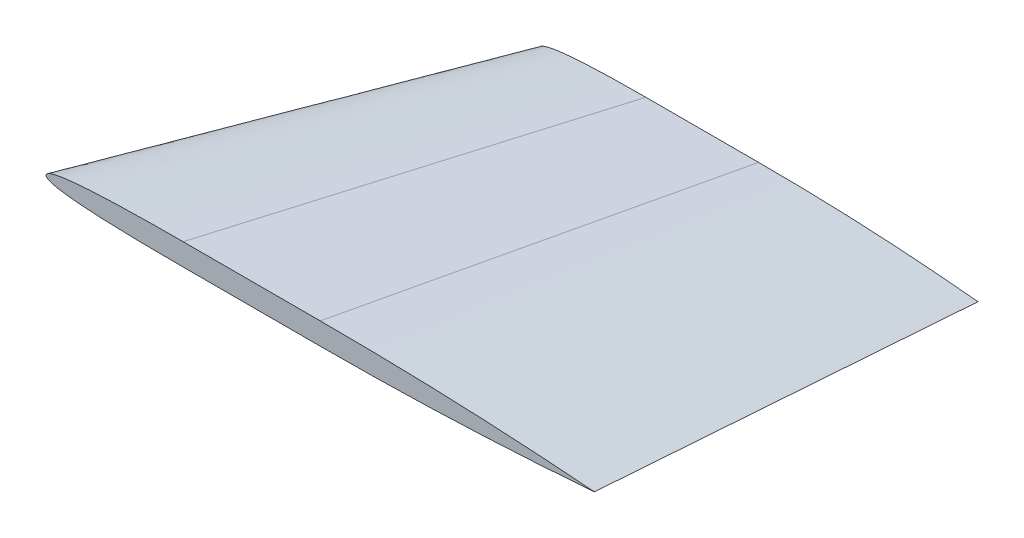
ISO-10303-21;
HEADER;
FILE_DESCRIPTION(('STEP AP214'),'2;1');
FILE_NAME('part.step','',(''),(''),'','','');
FILE_SCHEMA(('AUTOMOTIVE_DESIGN { 1 0 10303 214 1 1 1 1 }'));
ENDSEC;
DATA;
#1=APPLICATION_CONTEXT('core data for automotive mechanical design processes');
#2=APPLICATION_PROTOCOL_DEFINITION('international standard','automotive_design',2000,#1);
#3=PRODUCT_CONTEXT('',#1,'mechanical');
#4=PRODUCT('Part','Part','',(#3));
#5=PRODUCT_RELATED_PRODUCT_CATEGORY('part','',(#4));
#6=PRODUCT_DEFINITION_FORMATION('','',#4);
#7=PRODUCT_DEFINITION_CONTEXT('part definition',#1,'design');
#8=PRODUCT_DEFINITION('design','',#6,#7);
#9=PRODUCT_DEFINITION_SHAPE('','',#8);
#10=(LENGTH_UNIT() NAMED_UNIT(*) SI_UNIT(.MILLI.,.METRE.));
#11=(NAMED_UNIT(*) PLANE_ANGLE_UNIT() SI_UNIT($,.RADIAN.));
#12=(NAMED_UNIT(*) SI_UNIT($,.STERADIAN.) SOLID_ANGLE_UNIT());
#13=UNCERTAINTY_MEASURE_WITH_UNIT(LENGTH_MEASURE(1.E-05),#10,'distance_accuracy_value','');
#14=(GEOMETRIC_REPRESENTATION_CONTEXT(3) GLOBAL_UNCERTAINTY_ASSIGNED_CONTEXT((#13)) GLOBAL_UNIT_ASSIGNED_CONTEXT((#10,
#11,#12)) REPRESENTATION_CONTEXT('',''));
#15=CARTESIAN_POINT('',(0.,0.,0.));
#16=DIRECTION('',(0.,0.,1.));
#17=DIRECTION('',(1.,0.,0.));
#18=AXIS2_PLACEMENT_3D('',#15,#16,#17);
#19=CARTESIAN_POINT('',(-33.3550389878657,4.,-28.8888888888889));
#20=DIRECTION('',(0.,0.,1.));
#21=DIRECTION('',(1.,0.,0.));
#22=AXIS2_PLACEMENT_3D('',#19,#20,#21);
#23=PLANE('',#22);
#24=CARTESIAN_POINT('',(6.64496101213428,4.,-28.8888888888889));
#25=CARTESIAN_POINT('',(26.7077862215503,4.,-28.8888888888889));
#26=CARTESIAN_POINT('',(46.6449610121343,2.,-28.8888888888889));
#27=B_SPLINE_CURVE_WITH_KNOTS('',2,(#24,#25,#26),.UNSPECIFIED.,.F.,.F.,(3,3),(0.,1.),.UNSPECIFIED.);
#28=CARTESIAN_POINT('',(6.64496101213428,4.,-28.8888888888889));
#29=VERTEX_POINT('',#28);
#30=CARTESIAN_POINT('',(46.6449610121343,2.,-28.8888888888889));
#31=VERTEX_POINT('',#30);
#32=EDGE_CURVE('E179',#29,#31,#27,.T.);
#33=ORIENTED_EDGE('',*,*,#32,.T.);
#34=CARTESIAN_POINT('',(6.64496101213428,0.,-28.8888888888889));
#35=CARTESIAN_POINT('',(26.7077862215503,0.,-28.8888888888889));
#36=CARTESIAN_POINT('',(46.6449610121343,2.,-28.8888888888889));
#37=B_SPLINE_CURVE_WITH_KNOTS('',2,(#34,#35,#36),.UNSPECIFIED.,.F.,.F.,(3,3),(0.,1.),.UNSPECIFIED.);
#38=CARTESIAN_POINT('',(6.64496101213428,0.,-28.8888888888889));
#39=VERTEX_POINT('',#38);
#40=EDGE_CURVE('E230',#39,#31,#37,.T.);
#41=ORIENTED_EDGE('',*,*,#40,.F.);
#42=DIRECTION('',(-1.,0.,0.));
#43=VECTOR('',#42,1.);
#44=CARTESIAN_POINT('',(-33.3550389878657,0.,-28.8888888888889));
#45=LINE('',#44,#43);
#46=CARTESIAN_POINT('',(-13.9262542839707,0.,-28.8888888888889));
#47=VERTEX_POINT('',#46);
#48=EDGE_CURVE('E242',#39,#47,#45,.T.);
#49=ORIENTED_EDGE('',*,*,#48,.T.);
#50=CARTESIAN_POINT('',(-33.3550389878657,2.,-28.8888888888889));
#51=CARTESIAN_POINT('',(-33.4760150422879,-0.0145076739486985,-28.8888888888889));
#52=CARTESIAN_POINT('',(-13.3550389878657,0.,-28.8888888888889));
#53=B_SPLINE_CURVE_WITH_KNOTS('',2,(#50,#51,#52),.UNSPECIFIED.,.F.,.F.,(3,3),(0.,1.),.UNSPECIFIED.);
#54=CARTESIAN_POINT('',(-33.3550389878657,1.95213106263249,-28.8888888888889));
#55=VERTEX_POINT('',#54);
#56=EDGE_CURVE('E313',#55,#47,#53,.T.);
#57=ORIENTED_EDGE('',*,*,#56,.F.);
#58=DIRECTION('',(0.,-1.,0.));
#59=VECTOR('',#58,1.);
#60=CARTESIAN_POINT('',(-33.3550389878657,4.,-28.8888888888889));
#61=LINE('',#60,#59);
#62=CARTESIAN_POINT('',(-33.3550389878657,2.04786893736751,-28.8888888888889));
#63=VERTEX_POINT('',#62);
#64=EDGE_CURVE('E13',#63,#55,#61,.T.);
#65=ORIENTED_EDGE('',*,*,#64,.F.);
#66=CARTESIAN_POINT('',(-33.3550389878657,2.,-28.8888888888889));
#67=CARTESIAN_POINT('',(-33.4760150422879,4.0145076739487,-28.8888888888889));
#68=CARTESIAN_POINT('',(-13.3550389878657,4.,-28.8888888888889));
#69=B_SPLINE_CURVE_WITH_KNOTS('',2,(#66,#67,#68),.UNSPECIFIED.,.F.,.F.,(3,3),(0.,1.),.UNSPECIFIED.);
#70=CARTESIAN_POINT('',(-13.9262542699637,4.,-28.8888888888889));
#71=VERTEX_POINT('',#70);
#72=EDGE_CURVE('E394',#63,#71,#69,.T.);
#73=ORIENTED_EDGE('',*,*,#72,.T.);
#74=DIRECTION('',(-1.,0.,0.));
#75=VECTOR('',#74,1.);
#76=CARTESIAN_POINT('',(-33.3550389878657,4.,-28.8888888888889));
#77=LINE('',#76,#75);
#78=EDGE_CURVE('E258',#29,#71,#77,.T.);
#79=ORIENTED_EDGE('',*,*,#78,.F.);
#80=EDGE_LOOP('',(#33,#41,#49,#57,#65,#73,#79));
#81=FACE_BOUND('',#80,.T.);
#82=ADVANCED_FACE('F160',(#81),#23,.F.);
#83=CARTESIAN_POINT('',(-58.3062012651678,4.,36.1111111111111));
#84=DIRECTION('',(0.,0.,-1.));
#85=DIRECTION('',(-1.,0.,0.));
#86=AXIS2_PLACEMENT_3D('',#83,#84,#85);
#87=PLANE('',#86);
#88=CARTESIAN_POINT('',(-8.30620126516783,4.,36.1111111111111));
#89=CARTESIAN_POINT('',(16.7498645575744,3.99999999999985,36.1111111111111));
#90=CARTESIAN_POINT('',(41.6937987348322,2.,36.1111111111111));
#91=B_SPLINE_CURVE_WITH_KNOTS('',2,(#88,#89,#90),.UNSPECIFIED.,.F.,.F.,(3,3),(0.,1.),.UNSPECIFIED.);
#92=CARTESIAN_POINT('',(-8.30620126516783,4.,36.1111111111111));
#93=VERTEX_POINT('',#92);
#94=CARTESIAN_POINT('',(41.6937987348322,2.,36.1111111111111));
#95=VERTEX_POINT('',#94);
#96=EDGE_CURVE('E219',#93,#95,#91,.T.);
#97=ORIENTED_EDGE('',*,*,#96,.F.);
#98=DIRECTION('',(1.,0.,0.));
#99=VECTOR('',#98,1.);
#100=CARTESIAN_POINT('',(-58.3062012651678,4.,36.1111111111111));
#101=LINE('',#100,#99);
#102=CARTESIAN_POINT('',(-33.3062012651678,4.,36.1111111111111));
#103=VERTEX_POINT('',#102);
#104=EDGE_CURVE('E171',#103,#93,#101,.T.);
#105=ORIENTED_EDGE('',*,*,#104,.F.);
#106=CARTESIAN_POINT('',(-58.3062012651678,2.,36.1111111111111));
#107=CARTESIAN_POINT('',(-58.2981682863198,2.13185803387447,36.1111111111111));
#108=CARTESIAN_POINT('',(-58.1165495380855,2.35127824547839,36.111111111111));
#109=CARTESIAN_POINT('',(-57.6523540562812,2.59937777239833,36.1111111111112));
#110=CARTESIAN_POINT('',(-57.0197515682006,2.80617439716223,36.1111111111109));
#111=CARTESIAN_POINT('',(-56.3769150244662,2.95010416964718,36.1111111111112));
#112=CARTESIAN_POINT('',(-55.8568799760318,3.04843051159478,36.111111111111));
#113=CARTESIAN_POINT('',(-55.3359662965871,3.13504754543367,36.1111111111111));
#114=CARTESIAN_POINT('',(-54.6818489795879,3.2286430482675,36.1111111111112));
#115=CARTESIAN_POINT('',(-53.6326085869534,3.35434667278868,36.111111111111));
#116=CARTESIAN_POINT('',(-52.3173026060738,3.47915567883608,36.1111111111112));
#117=CARTESIAN_POINT('',(-50.7363419329291,3.59550791665806,36.1111111111111));
#118=CARTESIAN_POINT('',(-49.1537633268489,3.68800069592946,36.1111111111111));
#119=CARTESIAN_POINT('',(-47.5702823950902,3.76243746410943,36.1111111111112));
#120=CARTESIAN_POINT('',(-45.9861816087334,3.82258876530267,36.111111111111));
#121=CARTESIAN_POINT('',(-44.4016961914234,3.87109571460881,36.1111111111112));
#122=CARTESIAN_POINT('',(-42.8169399486992,3.9098609061408,36.1111111111111));
#123=CARTESIAN_POINT('',(-41.2320059940613,3.94034760640304,36.1111111111111));
#124=CARTESIAN_POINT('',(-39.1186009927977,3.97140917344183,36.1111111111111));
#125=CARTESIAN_POINT('',(-36.4766432024574,3.99460959973484,36.1111111111111));
#126=CARTESIAN_POINT('',(-34.3630212451883,4.,36.1111111111111));
#127=CARTESIAN_POINT('',(-33.3062012651678,4.,36.1111111111111));
#128=B_SPLINE_CURVE_WITH_KNOTS('',3,(#106,#107,#108,#109,#110,#111,#112,#113,#114,#115,#116,
#117,#118,#119,#120,#121,#122,#123,#124,#125,#126,#127),.UNSPECIFIED.,.F.,.F.,(4,1,1,1,1,1,1,1,
1,1,1,1,1,1,1,1,1,1,1,4),(0.474415888325319,0.481959711641861,0.489503534958403,
0.504591181591488,0.519678828224572,0.527222651541114,0.534766474857656,0.549854121490741,
0.564941768123825,0.595117061389994,0.625292354656163,0.655467647922332,0.685642941188501,
0.71581823445467,0.745993527720838,0.776168820987007,0.806344114253176,0.836519407519345,
0.896869994051683,0.95722058058402),.UNSPECIFIED.);
#129=CARTESIAN_POINT('',(-58.3057212466994,2.00600220058824,36.1111111111111));
#130=VERTEX_POINT('',#129);
#131=EDGE_CURVE('E280',#130,#103,#128,.T.);
#132=ORIENTED_EDGE('',*,*,#131,.F.);
#133=CARTESIAN_POINT('',(-58.3062012651678,2.,36.1111111111111));
#134=CARTESIAN_POINT('',(-58.1843584223458,0.,36.1111111111111));
#135=CARTESIAN_POINT('',(-33.3062012651678,0.,36.1111111111111));
#136=B_SPLINE_CURVE_WITH_KNOTS('',2,(#133,#134,#135),.UNSPECIFIED.,.F.,.F.,(3,3),(0.,1.),.UNSPECIFIED.);
#137=CARTESIAN_POINT('',(-33.3062012651678,0.,36.1111111111111));
#138=VERTEX_POINT('',#137);
#139=EDGE_CURVE('E253',#130,#138,#136,.T.);
#140=ORIENTED_EDGE('',*,*,#139,.T.);
#141=DIRECTION('',(1.,0.,0.));
#142=VECTOR('',#141,1.);
#143=CARTESIAN_POINT('',(-58.3062012651678,0.,36.1111111111111));
#144=LINE('',#143,#142);
#145=CARTESIAN_POINT('',(-8.30620126516783,0.,36.1111111111111));
#146=VERTEX_POINT('',#145);
#147=EDGE_CURVE('E237',#138,#146,#144,.T.);
#148=ORIENTED_EDGE('',*,*,#147,.T.);
#149=CARTESIAN_POINT('',(-8.30620126516783,0.,36.1111111111111));
#150=CARTESIAN_POINT('',(16.7498645575744,1.47444782547332E-13,36.1111111111111));
#151=CARTESIAN_POINT('',(41.6937987348322,2.,36.1111111111111));
#152=B_SPLINE_CURVE_WITH_KNOTS('',2,(#149,#150,#151),.UNSPECIFIED.,.F.,.F.,(3,3),(0.,1.),.UNSPECIFIED.);
#153=EDGE_CURVE('E187',#146,#95,#152,.T.);
#154=ORIENTED_EDGE('',*,*,#153,.T.);
#155=EDGE_LOOP('',(#97,#105,#132,#140,#148,#154));
#156=FACE_BOUND('',#155,.T.);
#157=ADVANCED_FACE('F234',(#156),#87,.F.);
#158=CARTESIAN_POINT('',(0.,0.,0.));
#159=DIRECTION('',(0.,-1.,0.));
#160=DIRECTION('',(0.,0.,-1.));
#161=AXIS2_PLACEMENT_3D('',#158,#159,#160);
#162=PLANE('',#161);
#163=ORIENTED_EDGE('',*,*,#48,.F.);
#164=DIRECTION('',(0.224164243499484,0.,-0.974551379833975));
#165=VECTOR('',#164,1.);
#166=CARTESIAN_POINT('',(-8.30620126516783,0.,36.1111111111111));
#167=LINE('',#166,#165);
#168=EDGE_CURVE('E231',#146,#39,#167,.T.);
#169=ORIENTED_EDGE('',*,*,#168,.F.);
#170=ORIENTED_EDGE('',*,*,#147,.F.);
#171=DIRECTION('',(0.285725184112015,-2.4522769170667E-09,-0.958311598158008));
#172=VECTOR('',#171,1.);
#173=CARTESIAN_POINT('',(-23.6161709018816,-8.31660599306728E-08,3.61111111111111));
#174=LINE('',#173,#172);
#175=EDGE_CURVE('E487',#138,#47,#174,.T.);
#176=ORIENTED_EDGE('',*,*,#175,.T.);
#177=EDGE_LOOP('',(#163,#169,#170,#176));
#178=FACE_BOUND('',#177,.T.);
#179=ADVANCED_FACE('F293',(#178),#162,.T.);
#180=CARTESIAN_POINT('',(-58.3062012651678,4.,36.1111111111111));
#181=DIRECTION('',(0.933580426497201,0.,0.358367949545301));
#182=DIRECTION('',(0.358367949545301,0.,-0.933580426497201));
#183=AXIS2_PLACEMENT_3D('',#180,#181,#182);
#184=PLANE('',#183);
#185=ORIENTED_EDGE('',*,*,#64,.T.);
#186=DIRECTION('',(0.358367864845314,-0.000687530652326152,-0.933580205846189));
#187=VECTOR('',#186,1.);
#188=CARTESIAN_POINT('',(-58.3062012651678,2.,36.1111111111111));
#189=LINE('',#188,#187);
#190=EDGE_CURVE('E323',#130,#55,#189,.T.);
#191=ORIENTED_EDGE('',*,*,#190,.F.);
#192=CARTESIAN_POINT('',(-58.3062012651678,2.,36.1111111111111));
#193=CARTESIAN_POINT('',(-49.9891471727338,2.01595631245584,14.4444444444444));
#194=CARTESIAN_POINT('',(-41.6720930802998,2.03191262491167,-7.22222222222223));
#195=CARTESIAN_POINT('',(-33.3550389878657,2.04786893736751,-28.8888888888889));
#196=B_SPLINE_CURVE_WITH_KNOTS('',3,(#192,#193,#194,#195),.UNSPECIFIED.,.F.,.F.,(4,4),(0.,1.),.UNSPECIFIED.);
#197=EDGE_CURVE('E346',#130,#63,#196,.T.);
#198=ORIENTED_EDGE('',*,*,#197,.T.);
#199=EDGE_LOOP('',(#185,#191,#198));
#200=FACE_BOUND('',#199,.T.);
#201=ADVANCED_FACE('F295',(#200),#184,.F.);
#202=CARTESIAN_POINT('',(0.,4.,0.));
#203=DIRECTION('',(0.,-1.,0.));
#204=DIRECTION('',(0.,0.,-1.));
#205=AXIS2_PLACEMENT_3D('',#202,#203,#204);
#206=PLANE('',#205);
#207=ORIENTED_EDGE('',*,*,#104,.T.);
#208=CARTESIAN_POINT('',(-8.30620126516783,4.,36.1111111111111));
#209=CARTESIAN_POINT('',(-3.32248050606713,4.,14.4444444444444));
#210=CARTESIAN_POINT('',(1.66124025303357,4.,-7.22222222222223));
#211=CARTESIAN_POINT('',(6.64496101213428,4.,-28.8888888888889));
#212=B_SPLINE_CURVE_WITH_KNOTS('',3,(#208,#209,#210,#211),.UNSPECIFIED.,.F.,.F.,(4,4),(0.,1.),.UNSPECIFIED.);
#213=EDGE_CURVE('E222',#93,#29,#212,.T.);
#214=ORIENTED_EDGE('',*,*,#213,.T.);
#215=ORIENTED_EDGE('',*,*,#78,.T.);
#216=CARTESIAN_POINT('',(-33.3062012651678,4.,36.1111111111111));
#217=CARTESIAN_POINT('',(-26.8461810229772,4.00000005544404,14.4444444444444));
#218=CARTESIAN_POINT('',(-20.3861607807866,4.00000011088808,-7.22222222222223));
#219=CARTESIAN_POINT('',(-13.926140538596,4.00000016633212,-28.8888888888889));
#220=B_SPLINE_CURVE_WITH_KNOTS('',3,(#216,#217,#218,#219),.UNSPECIFIED.,.F.,.F.,(4,4),(0.,1.),.UNSPECIFIED.);
#221=EDGE_CURVE('E340',#103,#71,#220,.T.);
#222=ORIENTED_EDGE('',*,*,#221,.F.);
#223=EDGE_LOOP('',(#207,#214,#215,#222));
#224=FACE_BOUND('',#223,.T.);
#225=ADVANCED_FACE('F374',(#224),#206,.F.);
#226=CARTESIAN_POINT('',(-33.3062012651678,4.,36.1111111111111));
#227=CARTESIAN_POINT('',(-26.8461810229772,4.00000005544404,14.4444444444444));
#228=CARTESIAN_POINT('',(-20.3861607807866,4.00000011088808,-7.22222222222223));
#229=CARTESIAN_POINT('',(-13.926140538596,4.00000016633212,-28.8888888888889));
#230=CARTESIAN_POINT('',(-34.3630212451883,4.,36.1111111111111));
#231=CARTESIAN_POINT('',(-27.8261915897555,3.99979870357711,14.4444444444444));
#232=CARTESIAN_POINT('',(-21.2893619343227,3.99959740715423,-7.22222222222223));
#233=CARTESIAN_POINT('',(-14.7525322788899,3.99939611073134,-28.8888888888889));
#234=CARTESIAN_POINT('',(-36.4766432024574,3.99460959973484,36.1111111111111));
#235=CARTESIAN_POINT('',(-29.7861940538096,3.99403649354233,14.4444444444445));
#236=CARTESIAN_POINT('',(-23.0957449051618,3.99346338734983,-7.22222222222222));
#237=CARTESIAN_POINT('',(-16.405295756514,3.99289028115733,-28.8888888888889));
#238=CARTESIAN_POINT('',(-39.1186009927977,3.97140917344183,36.1111111111111));
#239=CARTESIAN_POINT('',(-32.2361143335683,3.97045296866419,14.4444444444444));
#240=CARTESIAN_POINT('',(-25.3536276743389,3.96949676388656,-7.22222222222224));
#241=CARTESIAN_POINT('',(-18.4711410151095,3.96854055910892,-28.8888888888889));
#242=CARTESIAN_POINT('',(-41.2320059940613,3.94034760640304,36.1111111111111));
#243=CARTESIAN_POINT('',(-34.1958768269184,3.9391488160841,14.4444444444445));
#244=CARTESIAN_POINT('',(-27.1597476597754,3.93795002576517,-7.22222222222221));
#245=CARTESIAN_POINT('',(-20.1236184926325,3.93675123544623,-28.8888888888889));
#246=CARTESIAN_POINT('',(-42.8169399486992,3.9098609061408,36.1111111111111));
#247=CARTESIAN_POINT('',(-35.6655649568347,3.90849940743191,14.4444444444444));
#248=CARTESIAN_POINT('',(-28.5141899649702,3.90713790872301,-7.22222222222222));
#249=CARTESIAN_POINT('',(-21.3628149731057,3.90577641001412,-28.8888888888889));
#250=CARTESIAN_POINT('',(-44.4016961914234,3.87109571460881,36.1111111111112));
#251=CARTESIAN_POINT('',(-37.1350599819215,3.86962737381381,14.4444444444445));
#252=CARTESIAN_POINT('',(-29.8684237724196,3.86815903301881,-7.22222222222221));
#253=CARTESIAN_POINT('',(-22.6017875629176,3.86669069222381,-28.8888888888889));
#254=CARTESIAN_POINT('',(-45.9861816087334,3.82258876530267,36.111111111111));
#255=CARTESIAN_POINT('',(-38.6042583757296,3.821011527212,14.4444444444444));
#256=CARTESIAN_POINT('',(-31.2223351427259,3.81943428912134,-7.22222222222228));
#257=CARTESIAN_POINT('',(-23.8404119097221,3.81785705103068,-28.8888888888889));
#258=CARTESIAN_POINT('',(-47.5702823950902,3.76243746410943,36.1111111111112));
#259=CARTESIAN_POINT('',(-40.0730428171178,3.76083779453633,14.4444444444445));
#260=CARTESIAN_POINT('',(-32.5758032391454,3.75923812496322,-7.22222222222216));
#261=CARTESIAN_POINT('',(-25.078563661173,3.75763845539012,-28.8888888888888));
#262=CARTESIAN_POINT('',(-49.1537633268489,3.68800069592946,36.1111111111111));
#263=CARTESIAN_POINT('',(-41.5411345463942,3.68633469146878,14.4444444444444));
#264=CARTESIAN_POINT('',(-33.9285057659395,3.6846686870081,-7.22222222222227));
#265=CARTESIAN_POINT('',(-26.3158769854848,3.68300268254742,-28.8888888888889));
#266=CARTESIAN_POINT('',(-50.7363419329291,3.59550791665806,36.1111111111111));
#267=CARTESIAN_POINT('',(-43.0082770467265,3.59393514301935,14.4444444444445));
#268=CARTESIAN_POINT('',(-35.2802121605239,3.59236236938065,-7.22222222222221));
#269=CARTESIAN_POINT('',(-27.5521472743213,3.59078959574194,-28.8888888888889));
#270=CARTESIAN_POINT('',(-52.3173026060738,3.47915567883608,36.1111111111112));
#271=CARTESIAN_POINT('',(-44.4735826242776,3.47745577930235,14.4444444444445));
#272=CARTESIAN_POINT('',(-36.6298626424814,3.47575587976861,-7.22222222222221));
#273=CARTESIAN_POINT('',(-28.7861426606852,3.47405598023488,-28.8888888888889));
#274=CARTESIAN_POINT('',(-53.6326085869534,3.35434667278868,36.111111111111));
#275=CARTESIAN_POINT('',(-45.6924155806661,3.35290853706898,14.4444444444444));
#276=CARTESIAN_POINT('',(-37.7522225743789,3.35147040134929,-7.22222222222226));
#277=CARTESIAN_POINT('',(-29.8120295680917,3.35003226562959,-28.8888888888889));
#278=CARTESIAN_POINT('',(-54.6818489795879,3.2286430482675,36.1111111111112));
#279=CARTESIAN_POINT('',(-46.664087071584,3.2269190832924,14.4444444444445));
#280=CARTESIAN_POINT('',(-38.64632516358,3.2251951183173,-7.22222222222219));
#281=CARTESIAN_POINT('',(-30.6285632555761,3.22347115334219,-28.8888888888889));
#282=CARTESIAN_POINT('',(-55.3359662965871,3.13504754543367,36.1111111111111));
#283=CARTESIAN_POINT('',(-47.2694491896796,3.13317204646013,14.4444444444444));
#284=CARTESIAN_POINT('',(-39.2029320827721,3.13129654748659,-7.22222222222224));
#285=CARTESIAN_POINT('',(-31.1364149758645,3.12942104851305,-28.8888888888889));
#286=CARTESIAN_POINT('',(-55.8568799760318,3.04843051159478,36.111111111111));
#287=CARTESIAN_POINT('',(-47.7515073541673,3.04664607713689,14.4444444444444));
#288=CARTESIAN_POINT('',(-39.6461347323028,3.04486164267899,-7.22222222222225));
#289=CARTESIAN_POINT('',(-31.5407621104383,3.0430772082211,-28.8888888888889));
#290=CARTESIAN_POINT('',(-56.3769150244662,2.95010416964718,36.1111111111112));
#291=CARTESIAN_POINT('',(-48.2320876593962,2.94865103814577,14.4444444444445));
#292=CARTESIAN_POINT('',(-40.0872602943262,2.94719790664436,-7.22222222222218));
#293=CARTESIAN_POINT('',(-31.9424329292561,2.94574477514295,-28.8888888888889));
#294=CARTESIAN_POINT('',(-57.0197515682006,2.80617439716223,36.1111111111109));
#295=CARTESIAN_POINT('',(-48.825468735722,2.80303350023575,14.4444444444443));
#296=CARTESIAN_POINT('',(-40.6311859032434,2.79989260330927,-7.22222222222227));
#297=CARTESIAN_POINT('',(-32.4369030707648,2.79675170638278,-28.8888888888889));
#298=CARTESIAN_POINT('',(-57.6523540562812,2.59937777239833,36.1111111111112));
#299=CARTESIAN_POINT('',(-49.4063297918537,2.59738234556679,14.4444444444445));
#300=CARTESIAN_POINT('',(-41.1603055274261,2.59538691873525,-7.2222222222222));
#301=CARTESIAN_POINT('',(-32.9142812629986,2.59339149190371,-28.8888888888889));
#302=CARTESIAN_POINT('',(-58.1165495380855,2.35127824547839,36.111111111111));
#303=CARTESIAN_POINT('',(-49.8267815814307,2.34834338574636,14.4444444444444));
#304=CARTESIAN_POINT('',(-41.5370136247759,2.34540852601432,-7.22222222222224));
#305=CARTESIAN_POINT('',(-33.2472456681211,2.34247366628229,-28.8888888888889));
#306=CARTESIAN_POINT('',(-58.2981682863198,2.13185803387447,36.1111111111111));
#307=CARTESIAN_POINT('',(-49.9817027269526,2.13823123234283,14.4444444444444));
#308=CARTESIAN_POINT('',(-41.6652371675854,2.14460443081119,-7.22222222222223));
#309=CARTESIAN_POINT('',(-33.3487716082183,2.15097762927955,-28.8888888888889));
#310=CARTESIAN_POINT('',(-58.3062012651678,2.,36.1111111111111));
#311=CARTESIAN_POINT('',(-49.9891471727338,2.01595631245584,14.4444444444444));
#312=CARTESIAN_POINT('',(-41.6720930802998,2.03191262491167,-7.22222222222223));
#313=CARTESIAN_POINT('',(-33.3550389878657,2.04786893736751,-28.8888888888889));
#314=B_SPLINE_SURFACE_WITH_KNOTS('',3,3,((#226,#227,#228,#229),(#230,#231,#232,#233),(#234,#235,
#236,#237),(#238,#239,#240,#241),(#242,#243,#244,#245),(#246,#247,#248,#249),(#250,#251,#252,
#253),(#254,#255,#256,#257),(#258,#259,#260,#261),(#262,#263,#264,#265),(#266,#267,#268,#269),
(#270,#271,#272,#273),(#274,#275,#276,#277),(#278,#279,#280,#281),(#282,#283,#284,#285),(#286,
#287,#288,#289),(#290,#291,#292,#293),(#294,#295,#296,#297),(#298,#299,#300,#301),(#302,#303,
#304,#305),(#306,#307,#308,#309),(#310,#311,#312,#313)),.UNSPECIFIED.,.F.,.F.,.F.,(4,1,1,1,1,1,
1,1,1,1,1,1,1,1,1,1,1,1,1,4),(4,4),(0.474415888325319,0.534766474857656,0.595117061389994,
0.625292354656163,0.655467647922332,0.685642941188501,0.71581823445467,0.745993527720838,
0.776168820987007,0.806344114253176,0.836519407519345,0.866694700785514,0.881782347418598,
0.896869994051683,0.904413817368225,0.911957640684767,0.927045287317851,0.942132933950936,
0.949676757267478,0.95722058058402),(0.,1.),.UNSPECIFIED.);
#315=ORIENTED_EDGE('',*,*,#131,.T.);
#316=ORIENTED_EDGE('',*,*,#221,.T.);
#317=ORIENTED_EDGE('',*,*,#72,.F.);
#318=ORIENTED_EDGE('',*,*,#197,.F.);
#319=EDGE_LOOP('',(#315,#316,#317,#318));
#320=FACE_BOUND('',#319,.T.);
#321=ADVANCED_FACE('F363',(#320),#314,.F.);
#322=CARTESIAN_POINT('',(-58.3062012651678,2.,36.1111111111111));
#323=CARTESIAN_POINT('',(-33.3550389878654,1.95213106263251,-28.8888888888889));
#324=CARTESIAN_POINT('',(-58.2994891594274,1.88982355327673,36.1111111111111));
#325=CARTESIAN_POINT('',(-33.3498053077748,1.8660284266971,-28.8888888888889));
#326=CARTESIAN_POINT('',(-58.1797118547918,1.71483026010469,36.1111111111112));
#327=CARTESIAN_POINT('',(-33.288851742133,1.72710695761032,-28.8888888888889));
#328=CARTESIAN_POINT('',(-57.9889009732121,1.58595172562095,36.1111111111111));
#329=CARTESIAN_POINT('',(-33.1577597278369,1.59922280686354,-28.8888888888889));
#330=CARTESIAN_POINT('',(-57.6842127752439,1.41600995246449,36.111111111111));
#331=CARTESIAN_POINT('',(-32.935648575675,1.42825366534648,-28.888888888889));
#332=CARTESIAN_POINT('',(-57.4017469475072,1.31713475734683,36.111111111111));
#333=CARTESIAN_POINT('',(-32.7252493534992,1.32541384515125,-28.8888888888889));
#334=CARTESIAN_POINT('',(-56.8183498281804,1.1463246489394,36.1111111111111));
#335=CARTESIAN_POINT('',(-32.2820207954883,1.1532550106284,-28.8888888888889));
#336=CARTESIAN_POINT('',(-56.4086597139562,1.05625876986508,36.1111111111111));
#337=CARTESIAN_POINT('',(-31.9668954476026,1.06193707351832,-28.8888888888889));
#338=CARTESIAN_POINT('',(-55.4092571549562,0.867755187402918,36.1111111111112));
#339=CARTESIAN_POINT('',(-31.1941954844609,0.873180841532422,-28.8888888888889));
#340=CARTESIAN_POINT('',(-54.6930763473144,0.770538240067332,36.1111111111112));
#341=CARTESIAN_POINT('',(-30.6375417033504,0.77517906477767,-28.8888888888889));
#342=CARTESIAN_POINT('',(-53.4041702475944,0.623795037599257,36.1111111111111));
#343=CARTESIAN_POINT('',(-29.6337716035038,0.628517469490254,-28.8888888888889));
#344=CARTESIAN_POINT('',(-52.7050761358045,0.558583868421709,36.1111111111111));
#345=CARTESIAN_POINT('',(-29.0885930149527,0.563277895070508,-28.8888888888889));
#346=CARTESIAN_POINT('',(-50.3986930030005,0.370737057530838,36.1111111111111));
#347=CARTESIAN_POINT('',(-27.2888468601078,0.37588869339515,-28.8888888888889));
#348=CARTESIAN_POINT('',(-48.6719988469027,0.281800345177946,36.1111111111111));
#349=CARTESIAN_POINT('',(-25.939662754745,0.286707267439956,-28.8888888888889));
#350=CARTESIAN_POINT('',(-42.4393161755487,0.0347998275295129,36.111111111111));
#351=CARTESIAN_POINT('',(-21.0683055101272,0.0395183336699449,-28.8888888888889));
#352=CARTESIAN_POINT('',(-37.8562644801652,0.,36.1111111111111));
#353=CARTESIAN_POINT('',(-17.4841119088547,0.00260055246601917,-28.8888888888889));
#354=CARTESIAN_POINT('',(-33.3062012651678,0.,36.1111111111111));
#355=CARTESIAN_POINT('',(-13.9261405385953,-1.66332119861346E-07,-28.8888888888889));
#356=B_SPLINE_SURFACE_WITH_KNOTS('',3,1,((#322,#323),(#324,#325),(#326,#327),(#328,#329),(#330,
#331),(#332,#333),(#334,#335),(#336,#337),(#338,#339),(#340,#341),(#342,#343),(#344,#345),(#346,
#347),(#348,#349),(#350,#351),(#352,#353),(#354,#355)),.UNSPECIFIED.,.F.,.F.,.F.,(4,1,1,1,1,1,1,
1,1,1,1,1,1,1,4),(2,2),(0.,0.0130335558260233,0.0236646502785043,0.0270654432242707,
0.0543505595370666,0.0588989819291337,0.0988700618423399,0.103921517030962,0.179200697813376,
0.184331067599725,0.257356535356878,0.262237314930706,0.458038546790629,0.461820218702176,1.),
(0.,1.),.UNSPECIFIED.);
#357=ORIENTED_EDGE('',*,*,#139,.F.);
#358=ORIENTED_EDGE('',*,*,#190,.T.);
#359=ORIENTED_EDGE('',*,*,#56,.T.);
#360=ORIENTED_EDGE('',*,*,#175,.F.);
#361=EDGE_LOOP('',(#357,#358,#359,#360));
#362=FACE_BOUND('',#361,.T.);
#363=ADVANCED_FACE('F373',(#362),#356,.F.);
#364=CARTESIAN_POINT('',(-8.30620126516783,0.,36.1111111111111));
#365=CARTESIAN_POINT('',(6.64496101213428,0.,-28.8888888888889));
#366=CARTESIAN_POINT('',(16.7498645575744,1.47444782547332E-13,36.1111111111111));
#367=CARTESIAN_POINT('',(26.7077862215503,0.,-28.8888888888889));
#368=CARTESIAN_POINT('',(41.6937987348322,2.,36.1111111111111));
#369=CARTESIAN_POINT('',(46.6449610121343,2.,-28.8888888888889));
#370=B_SPLINE_SURFACE_WITH_KNOTS('',2,1,((#364,#365),(#366,#367),(#368,#369)),.UNSPECIFIED.,.F.,
.F.,.F.,(3,3),(2,2),(0.,1.),(0.,1.),.UNSPECIFIED.);
#371=DIRECTION('',(0.0759517051198801,0.,-0.997111497521407));
#372=VECTOR('',#371,1.);
#373=CARTESIAN_POINT('',(44.1693798734832,2.,3.61111111111111));
#374=LINE('',#373,#372);
#375=EDGE_CURVE('E221',#95,#31,#374,.T.);
#376=ORIENTED_EDGE('',*,*,#153,.F.);
#377=ORIENTED_EDGE('',*,*,#168,.T.);
#378=ORIENTED_EDGE('',*,*,#40,.T.);
#379=ORIENTED_EDGE('',*,*,#375,.F.);
#380=EDGE_LOOP('',(#376,#377,#378,#379));
#381=FACE_BOUND('',#380,.T.);
#382=ADVANCED_FACE('F228',(#381),#370,.F.);
#383=CARTESIAN_POINT('',(41.6937987348322,2.,36.1111111111111));
#384=CARTESIAN_POINT('',(43.3441861605995,2.,14.4444444444444));
#385=CARTESIAN_POINT('',(44.9945735863669,2.,-7.22222222222223));
#386=CARTESIAN_POINT('',(46.6449610121343,2.,-28.8888888888889));
#387=CARTESIAN_POINT('',(37.5364763719559,2.33333333333331,36.1111111111111));
#388=CARTESIAN_POINT('',(39.4650170969829,2.33333333333332,14.4444444444444));
#389=CARTESIAN_POINT('',(41.3935578220099,2.33333333333333,-7.22222222222223));
#390=CARTESIAN_POINT('',(43.322098547037,2.33333333333333,-28.8888888888889));
#391=CARTESIAN_POINT('',(29.2171594943081,2.9166666666666,36.1111111111111));
#392=CARTESIAN_POINT('',(31.7018190571135,2.91666666666663,14.4444444444444));
#393=CARTESIAN_POINT('',(34.1864786199189,2.91666666666665,-7.22222222222221));
#394=CARTESIAN_POINT('',(36.6711381827243,2.91666666666667,-28.8888888888889));
#395=CARTESIAN_POINT('',(16.7241677221509,3.54166666666659,36.1111111111111));
#396=CARTESIAN_POINT('',(20.042442259401,3.54166666666661,14.4444444444444));
#397=CARTESIAN_POINT('',(23.3607167966512,3.54166666666664,-7.22222222222227));
#398=CARTESIAN_POINT('',(26.6789913339013,3.54166666666667,-28.8888888888889));
#399=CARTESIAN_POINT('',(4.21715949430808,3.9166666666666,36.1111111111111));
#400=CARTESIAN_POINT('',(8.36848572378016,3.91666666666662,14.4444444444445));
#401=CARTESIAN_POINT('',(12.5198119532522,3.91666666666664,-7.2222222222222));
#402=CARTESIAN_POINT('',(16.6711381827243,3.91666666666667,-28.8888888888889));
#403=CARTESIAN_POINT('',(-4.1301902947108,3.99999999999998,36.1111111111111));
#404=CARTESIAN_POINT('',(0.576128208094008,3.99999999999998,14.4444444444444));
#405=CARTESIAN_POINT('',(5.28244671089881,3.99999999999999,-7.22222222222223));
#406=CARTESIAN_POINT('',(9.98876521370362,4.,-28.8888888888889));
#407=CARTESIAN_POINT('',(-8.30620126516783,4.,36.1111111111111));
#408=CARTESIAN_POINT('',(-3.32248050606713,4.,14.4444444444444));
#409=CARTESIAN_POINT('',(1.66124025303357,4.,-7.22222222222223));
#410=CARTESIAN_POINT('',(6.64496101213428,4.,-28.8888888888889));
#411=B_SPLINE_SURFACE_WITH_KNOTS('',3,3,((#383,#384,#385,#386),(#387,#388,#389,#390),(#391,#392,
#393,#394),(#395,#396,#397,#398),(#399,#400,#401,#402),(#403,#404,#405,#406),(#407,#408,#409,
#410)),.UNSPECIFIED.,.F.,.F.,.F.,(4,1,1,1,4),(4,4),(0.,0.122335441753358,0.244670883506716,
0.367006325260075,0.489341767013433),(0.,1.),.UNSPECIFIED.);
#412=ORIENTED_EDGE('',*,*,#96,.T.);
#413=ORIENTED_EDGE('',*,*,#375,.T.);
#414=ORIENTED_EDGE('',*,*,#32,.F.);
#415=ORIENTED_EDGE('',*,*,#213,.F.);
#416=EDGE_LOOP('',(#412,#413,#414,#415));
#417=FACE_BOUND('',#416,.T.);
#418=ADVANCED_FACE('F220',(#417),#411,.F.);
#419=CLOSED_SHELL('',(#82,#157,#179,#201,#225,#321,#363,#382,#418));
#420=MANIFOLD_SOLID_BREP('B2',#419);
#421=ADVANCED_BREP_SHAPE_REPRESENTATION('',(#18,#420),#14);
#422=SHAPE_DEFINITION_REPRESENTATION(#9,#421);
ENDSEC;
END-ISO-10303-21;
